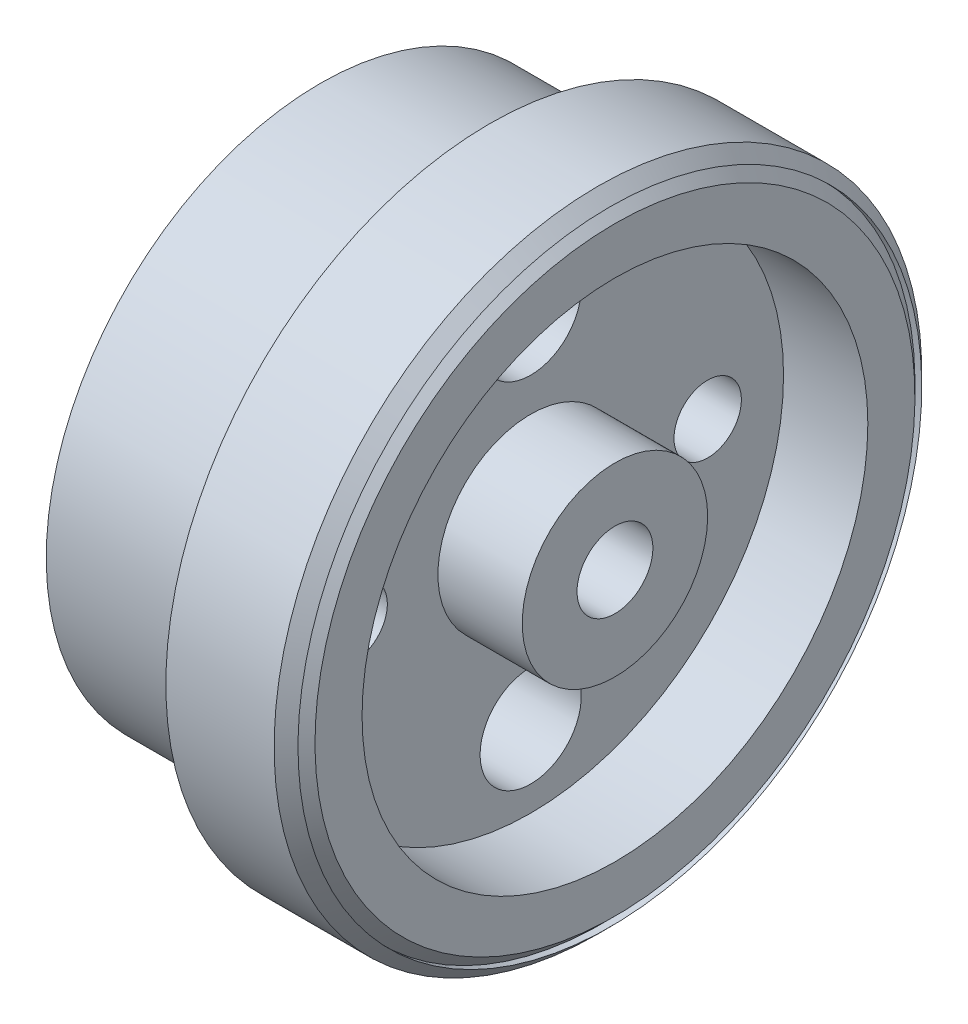
ISO-10303-21;
HEADER;
FILE_DESCRIPTION(('STEP AP214'),'2;1');
FILE_NAME('part.step','',(''),(''),'','','');
FILE_SCHEMA(('AUTOMOTIVE_DESIGN { 1 0 10303 214 1 1 1 1 }'));
ENDSEC;
DATA;
#1=APPLICATION_CONTEXT('core data for automotive mechanical design processes');
#2=APPLICATION_PROTOCOL_DEFINITION('international standard','automotive_design',2000,#1);
#3=PRODUCT_CONTEXT('',#1,'mechanical');
#4=PRODUCT('Part','Part','',(#3));
#5=PRODUCT_RELATED_PRODUCT_CATEGORY('part','',(#4));
#6=PRODUCT_DEFINITION_FORMATION('','',#4);
#7=PRODUCT_DEFINITION_CONTEXT('part definition',#1,'design');
#8=PRODUCT_DEFINITION('design','',#6,#7);
#9=PRODUCT_DEFINITION_SHAPE('','',#8);
#10=(LENGTH_UNIT() NAMED_UNIT(*) SI_UNIT(.MILLI.,.METRE.));
#11=(NAMED_UNIT(*) PLANE_ANGLE_UNIT() SI_UNIT($,.RADIAN.));
#12=(NAMED_UNIT(*) SI_UNIT($,.STERADIAN.) SOLID_ANGLE_UNIT());
#13=UNCERTAINTY_MEASURE_WITH_UNIT(LENGTH_MEASURE(1.E-05),#10,'distance_accuracy_value','');
#14=(GEOMETRIC_REPRESENTATION_CONTEXT(3) GLOBAL_UNCERTAINTY_ASSIGNED_CONTEXT((#13)) GLOBAL_UNIT_ASSIGNED_CONTEXT((#10,
#11,#12)) REPRESENTATION_CONTEXT('',''));
#15=CARTESIAN_POINT('',(0.,0.,0.));
#16=DIRECTION('',(0.,0.,1.));
#17=DIRECTION('',(1.,0.,0.));
#18=AXIS2_PLACEMENT_3D('',#15,#16,#17);
#19=CARTESIAN_POINT('',(0.,-4.5,0.));
#20=DIRECTION('',(-1.,0.,0.));
#21=DIRECTION('',(0.,-1.,0.));
#22=AXIS2_PLACEMENT_3D('',#19,#20,#21);
#23=PLANE('',#22);
#24=CARTESIAN_POINT('',(0.,0.,0.));
#25=DIRECTION('',(1.,0.,0.));
#26=DIRECTION('',(0.,1.,0.));
#27=AXIS2_PLACEMENT_3D('',#24,#25,#26);
#28=CIRCLE('',#27,4.5);
#29=CARTESIAN_POINT('',(0.,4.5,0.));
#30=VERTEX_POINT('',#29);
#31=EDGE_CURVE('E38',#30,#30,#28,.T.);
#32=ORIENTED_EDGE('',*,*,#31,.F.);
#33=EDGE_LOOP('',(#32));
#34=FACE_BOUND('',#33,.T.);
#35=CARTESIAN_POINT('',(0.,0.,0.));
#36=DIRECTION('',(1.,0.,0.));
#37=DIRECTION('',(0.,0.,-1.));
#38=AXIS2_PLACEMENT_3D('',#35,#36,#37);
#39=CIRCLE('',#38,11.0000000000005);
#40=CARTESIAN_POINT('',(0.,0.,-11.0000000000005));
#41=VERTEX_POINT('',#40);
#42=EDGE_CURVE('E97',#41,#41,#39,.T.);
#43=ORIENTED_EDGE('',*,*,#42,.T.);
#44=EDGE_LOOP('',(#43));
#45=FACE_BOUND('',#44,.T.);
#46=ADVANCED_FACE('F31',(#34,#45),#23,.F.);
#47=CARTESIAN_POINT('',(-1.41421356237327,0.,0.));
#48=DIRECTION('',(-1.,0.,0.));
#49=DIRECTION('',(0.,-1.,0.));
#50=AXIS2_PLACEMENT_3D('',#47,#48,#49);
#51=CONICAL_SURFACE('',#50,37.,0.785398163397326);
#52=CARTESIAN_POINT('',(0.,0.,0.));
#53=DIRECTION('',(1.,0.,0.));
#54=DIRECTION('',(0.,1.,0.));
#55=AXIS2_PLACEMENT_3D('',#52,#53,#54);
#56=CIRCLE('',#55,35.5857864376271);
#57=CARTESIAN_POINT('',(0.,35.5857864376271,0.));
#58=VERTEX_POINT('',#57);
#59=EDGE_CURVE('E10',#58,#58,#56,.T.);
#60=ORIENTED_EDGE('',*,*,#59,.F.);
#61=EDGE_LOOP('',(#60));
#62=FACE_BOUND('',#61,.T.);
#63=CARTESIAN_POINT('',(-1.41421356237327,0.,0.));
#64=DIRECTION('',(1.,0.,0.));
#65=DIRECTION('',(0.,1.,0.));
#66=AXIS2_PLACEMENT_3D('',#63,#64,#65);
#67=CIRCLE('',#66,37.);
#68=CARTESIAN_POINT('',(-1.41421356237328,37.,0.));
#69=VERTEX_POINT('',#68);
#70=EDGE_CURVE('E87',#69,#69,#67,.T.);
#71=ORIENTED_EDGE('',*,*,#70,.T.);
#72=EDGE_LOOP('',(#71));
#73=FACE_BOUND('',#72,.T.);
#74=ADVANCED_FACE('F33',(#62,#73),#51,.T.);
#75=CARTESIAN_POINT('',(0.,0.,0.));
#76=DIRECTION('',(1.,0.,0.));
#77=DIRECTION('',(0.,0.,-1.));
#78=AXIS2_PLACEMENT_3D('',#75,#76,#77);
#79=CIRCLE('',#78,30.);
#80=CARTESIAN_POINT('',(0.,0.,-30.));
#81=VERTEX_POINT('',#80);
#82=EDGE_CURVE('E91',#81,#81,#79,.T.);
#83=ORIENTED_EDGE('',*,*,#82,.F.);
#84=EDGE_LOOP('',(#83));
#85=FACE_BOUND('',#84,.T.);
#86=ORIENTED_EDGE('',*,*,#59,.T.);
#87=EDGE_LOOP('',(#86));
#88=FACE_BOUND('',#87,.T.);
#89=ADVANCED_FACE('F152',(#85,#88),#23,.F.);
#90=CARTESIAN_POINT('',(0.,0.,0.));
#91=DIRECTION('',(1.,0.,0.));
#92=DIRECTION('',(0.,1.,0.));
#93=AXIS2_PLACEMENT_3D('',#90,#91,#92);
#94=CYLINDRICAL_SURFACE('',#93,4.5);
#95=CARTESIAN_POINT('',(-20.4141633410307,0.,0.));
#96=DIRECTION('',(1.,0.,0.));
#97=DIRECTION('',(0.,1.,0.));
#98=AXIS2_PLACEMENT_3D('',#95,#96,#97);
#99=CIRCLE('',#98,4.5);
#100=CARTESIAN_POINT('',(-20.4141633410307,4.5,0.));
#101=VERTEX_POINT('',#100);
#102=EDGE_CURVE('E42',#101,#101,#99,.T.);
#103=ORIENTED_EDGE('',*,*,#102,.F.);
#104=EDGE_LOOP('',(#103));
#105=FACE_BOUND('',#104,.T.);
#106=ORIENTED_EDGE('',*,*,#31,.T.);
#107=EDGE_LOOP('',(#106));
#108=FACE_BOUND('',#107,.T.);
#109=ADVANCED_FACE('F154',(#105,#108),#94,.F.);
#110=CARTESIAN_POINT('',(-20.4141633410307,0.,0.));
#111=DIRECTION('',(-1.,0.,0.));
#112=DIRECTION('',(0.,-1.,0.));
#113=AXIS2_PLACEMENT_3D('',#110,#111,#112);
#114=CONICAL_SURFACE('',#113,4.5,0.785398163397443);
#115=CARTESIAN_POINT('',(-23.4290294676044,0.,0.));
#116=DIRECTION('',(1.,0.,0.));
#117=DIRECTION('',(0.,1.,0.));
#118=AXIS2_PLACEMENT_3D('',#115,#116,#117);
#119=CIRCLE('',#118,7.51486612657374);
#120=CARTESIAN_POINT('',(-23.4290294676044,7.51486612657374,0.));
#121=VERTEX_POINT('',#120);
#122=EDGE_CURVE('E46',#121,#121,#119,.T.);
#123=ORIENTED_EDGE('',*,*,#122,.F.);
#124=EDGE_LOOP('',(#123));
#125=FACE_BOUND('',#124,.T.);
#126=ORIENTED_EDGE('',*,*,#102,.T.);
#127=EDGE_LOOP('',(#126));
#128=FACE_BOUND('',#127,.T.);
#129=ADVANCED_FACE('F159',(#125,#128),#114,.F.);
#130=CARTESIAN_POINT('',(0.,0.,0.));
#131=DIRECTION('',(1.,0.,0.));
#132=DIRECTION('',(0.,1.,0.));
#133=AXIS2_PLACEMENT_3D('',#130,#131,#132);
#134=CYLINDRICAL_SURFACE('',#133,7.51486612657374);
#135=CARTESIAN_POINT('',(-43.4290294676045,0.,0.));
#136=DIRECTION('',(1.,0.,0.));
#137=DIRECTION('',(0.,1.,0.));
#138=AXIS2_PLACEMENT_3D('',#135,#136,#137);
#139=CIRCLE('',#138,7.51486612657374);
#140=CARTESIAN_POINT('',(-43.4290294676045,7.51486612657373,0.));
#141=VERTEX_POINT('',#140);
#142=EDGE_CURVE('E51',#141,#141,#139,.T.);
#143=ORIENTED_EDGE('',*,*,#142,.F.);
#144=EDGE_LOOP('',(#143));
#145=FACE_BOUND('',#144,.T.);
#146=ORIENTED_EDGE('',*,*,#122,.T.);
#147=EDGE_LOOP('',(#146));
#148=FACE_BOUND('',#147,.T.);
#149=ADVANCED_FACE('F228',(#145,#148),#134,.F.);
#150=CARTESIAN_POINT('',(-43.4290294676045,0.,0.));
#151=DIRECTION('',(-1.,0.,0.));
#152=DIRECTION('',(0.,-1.,0.));
#153=AXIS2_PLACEMENT_3D('',#150,#151,#152);
#154=CONICAL_SURFACE('',#153,7.51486612657374,0.700591132353698);
#155=CARTESIAN_POINT('',(-44.9579519391178,0.,0.));
#156=DIRECTION('',(1.,0.,0.));
#157=DIRECTION('',(0.,1.,0.));
#158=AXIS2_PLACEMENT_3D('',#155,#156,#157);
#159=CIRCLE('',#158,8.80420552180743);
#160=CARTESIAN_POINT('',(-44.9579519391178,8.80420552180742,0.));
#161=VERTEX_POINT('',#160);
#162=EDGE_CURVE('E54',#161,#161,#159,.T.);
#163=ORIENTED_EDGE('',*,*,#162,.F.);
#164=EDGE_LOOP('',(#163));
#165=FACE_BOUND('',#164,.T.);
#166=ORIENTED_EDGE('',*,*,#142,.T.);
#167=EDGE_LOOP('',(#166));
#168=FACE_BOUND('',#167,.T.);
#169=ADVANCED_FACE('F224',(#165,#168),#154,.F.);
#170=CARTESIAN_POINT('',(-44.9579519391178,-8.80420552180743,0.));
#171=DIRECTION('',(1.,0.,0.));
#172=DIRECTION('',(0.,1.,0.));
#173=AXIS2_PLACEMENT_3D('',#170,#171,#172);
#174=PLANE('',#173);
#175=CARTESIAN_POINT('',(-44.9579519391177,0.,0.));
#176=DIRECTION('',(1.,0.,0.));
#177=DIRECTION('',(0.,1.,0.));
#178=AXIS2_PLACEMENT_3D('',#175,#176,#177);
#179=CIRCLE('',#178,11.);
#180=CARTESIAN_POINT('',(-44.9579519391177,11.,0.));
#181=VERTEX_POINT('',#180);
#182=EDGE_CURVE('E57',#181,#181,#179,.T.);
#183=ORIENTED_EDGE('',*,*,#182,.F.);
#184=EDGE_LOOP('',(#183));
#185=FACE_BOUND('',#184,.T.);
#186=ORIENTED_EDGE('',*,*,#162,.T.);
#187=EDGE_LOOP('',(#186));
#188=FACE_BOUND('',#187,.T.);
#189=ADVANCED_FACE('F220',(#185,#188),#174,.F.);
#190=CARTESIAN_POINT('',(0.,0.,0.));
#191=DIRECTION('',(1.,0.,0.));
#192=DIRECTION('',(0.,1.,0.));
#193=AXIS2_PLACEMENT_3D('',#190,#191,#192);
#194=CYLINDRICAL_SURFACE('',#193,11.);
#195=CARTESIAN_POINT('',(-36.9579519391177,0.,0.));
#196=DIRECTION('',(1.,0.,0.));
#197=DIRECTION('',(0.,1.,0.));
#198=AXIS2_PLACEMENT_3D('',#195,#196,#197);
#199=CIRCLE('',#198,11.);
#200=CARTESIAN_POINT('',(-36.9579519391177,11.,0.));
#201=VERTEX_POINT('',#200);
#202=EDGE_CURVE('E60',#201,#201,#199,.T.);
#203=ORIENTED_EDGE('',*,*,#202,.F.);
#204=EDGE_LOOP('',(#203));
#205=FACE_BOUND('',#204,.T.);
#206=ORIENTED_EDGE('',*,*,#182,.T.);
#207=EDGE_LOOP('',(#206));
#208=FACE_BOUND('',#207,.T.);
#209=ADVANCED_FACE('F216',(#205,#208),#194,.T.);
#210=CARTESIAN_POINT('',(-36.9579519391177,-11.0143437946253,0.));
#211=DIRECTION('',(1.,0.,0.));
#212=DIRECTION('',(0.,1.,0.));
#213=AXIS2_PLACEMENT_3D('',#210,#211,#212);
#214=PLANE('',#213);
#215=CARTESIAN_POINT('',(-36.9579519391177,0.,0.));
#216=DIRECTION('',(1.,0.,0.));
#217=DIRECTION('',(0.,1.,0.));
#218=AXIS2_PLACEMENT_3D('',#215,#216,#217);
#219=CIRCLE('',#218,11.0143437946253);
#220=CARTESIAN_POINT('',(-36.9579519391177,11.0143437946253,0.));
#221=VERTEX_POINT('',#220);
#222=EDGE_CURVE('E63',#221,#221,#219,.T.);
#223=ORIENTED_EDGE('',*,*,#222,.F.);
#224=EDGE_LOOP('',(#223));
#225=FACE_BOUND('',#224,.T.);
#226=ORIENTED_EDGE('',*,*,#202,.T.);
#227=EDGE_LOOP('',(#226));
#228=FACE_BOUND('',#227,.T.);
#229=ADVANCED_FACE('F212',(#225,#228),#214,.F.);
#230=CARTESIAN_POINT('',(0.,0.,0.));
#231=DIRECTION('',(1.,0.,0.));
#232=DIRECTION('',(0.,1.,0.));
#233=AXIS2_PLACEMENT_3D('',#230,#231,#232);
#234=CYLINDRICAL_SURFACE('',#233,11.0143437946253);
#235=CARTESIAN_POINT('',(-34.9579519391177,0.,0.));
#236=DIRECTION('',(1.,0.,0.));
#237=DIRECTION('',(0.,1.,0.));
#238=AXIS2_PLACEMENT_3D('',#235,#236,#237);
#239=CIRCLE('',#238,11.0143437946253);
#240=CARTESIAN_POINT('',(-34.9579519391177,11.0143437946253,0.));
#241=VERTEX_POINT('',#240);
#242=EDGE_CURVE('E66',#241,#241,#239,.T.);
#243=ORIENTED_EDGE('',*,*,#242,.F.);
#244=EDGE_LOOP('',(#243));
#245=FACE_BOUND('',#244,.T.);
#246=ORIENTED_EDGE('',*,*,#222,.T.);
#247=EDGE_LOOP('',(#246));
#248=FACE_BOUND('',#247,.T.);
#249=ADVANCED_FACE('F208',(#245,#248),#234,.T.);
#250=CARTESIAN_POINT('',(-34.9579519391177,-32.5075953347839,0.));
#251=DIRECTION('',(1.,0.,0.));
#252=DIRECTION('',(0.,1.,0.));
#253=AXIS2_PLACEMENT_3D('',#250,#251,#252);
#254=PLANE('',#253);
#255=CARTESIAN_POINT('',(-34.9579519391177,-21.,0.));
#256=DIRECTION('',(1.,0.,0.));
#257=DIRECTION('',(0.,-1.,0.));
#258=AXIS2_PLACEMENT_3D('',#255,#256,#257);
#259=CIRCLE('',#258,6.00000000000048);
#260=CARTESIAN_POINT('',(-34.9579519391177,-27.0000000000005,0.));
#261=VERTEX_POINT('',#260);
#262=EDGE_CURVE('E120',#261,#261,#259,.T.);
#263=ORIENTED_EDGE('',*,*,#262,.T.);
#264=EDGE_LOOP('',(#263));
#265=FACE_BOUND('',#264,.T.);
#266=CARTESIAN_POINT('',(-34.9579519391178,21.,0.));
#267=DIRECTION('',(1.,0.,0.));
#268=DIRECTION('',(0.,1.,0.));
#269=AXIS2_PLACEMENT_3D('',#266,#267,#268);
#270=CIRCLE('',#269,6.00000000000048);
#271=CARTESIAN_POINT('',(-34.9579519391178,27.0000000000005,0.));
#272=VERTEX_POINT('',#271);
#273=EDGE_CURVE('E112',#272,#272,#270,.T.);
#274=ORIENTED_EDGE('',*,*,#273,.T.);
#275=EDGE_LOOP('',(#274));
#276=FACE_BOUND('',#275,.T.);
#277=CARTESIAN_POINT('',(-34.9579519391178,0.,-21.));
#278=DIRECTION('',(1.,0.,0.));
#279=DIRECTION('',(0.,1.,0.));
#280=AXIS2_PLACEMENT_3D('',#277,#278,#279);
#281=CIRCLE('',#280,4.);
#282=CARTESIAN_POINT('',(-34.9579519391178,4.,-21.));
#283=VERTEX_POINT('',#282);
#284=EDGE_CURVE('E100',#283,#283,#281,.T.);
#285=ORIENTED_EDGE('',*,*,#284,.T.);
#286=EDGE_LOOP('',(#285));
#287=FACE_BOUND('',#286,.T.);
#288=CARTESIAN_POINT('',(-34.9579519391178,0.,21.));
#289=DIRECTION('',(1.,0.,0.));
#290=DIRECTION('',(0.,1.,0.));
#291=AXIS2_PLACEMENT_3D('',#288,#289,#290);
#292=CIRCLE('',#291,4.);
#293=CARTESIAN_POINT('',(-34.9579519391178,4.,21.));
#294=VERTEX_POINT('',#293);
#295=EDGE_CURVE('E105',#294,#294,#292,.T.);
#296=ORIENTED_EDGE('',*,*,#295,.T.);
#297=EDGE_LOOP('',(#296));
#298=FACE_BOUND('',#297,.T.);
#299=CARTESIAN_POINT('',(-34.9579519391178,0.,0.));
#300=DIRECTION('',(1.,0.,0.));
#301=DIRECTION('',(0.,1.,0.));
#302=AXIS2_PLACEMENT_3D('',#299,#300,#301);
#303=CIRCLE('',#302,32.5075953347839);
#304=CARTESIAN_POINT('',(-34.9579519391178,32.5075953347839,0.));
#305=VERTEX_POINT('',#304);
#306=EDGE_CURVE('E69',#305,#305,#303,.T.);
#307=ORIENTED_EDGE('',*,*,#306,.F.);
#308=EDGE_LOOP('',(#307));
#309=FACE_BOUND('',#308,.T.);
#310=ORIENTED_EDGE('',*,*,#242,.T.);
#311=EDGE_LOOP('',(#310));
#312=FACE_BOUND('',#311,.T.);
#313=ADVANCED_FACE('F204',(#265,#276,#287,#298,#309,#312),#254,.F.);
#314=CARTESIAN_POINT('',(0.,0.,0.));
#315=DIRECTION('',(1.,0.,0.));
#316=DIRECTION('',(0.,1.,0.));
#317=AXIS2_PLACEMENT_3D('',#314,#315,#316);
#318=CYLINDRICAL_SURFACE('',#317,32.5075953347839);
#319=CARTESIAN_POINT('',(-15.9579519391178,0.,0.));
#320=DIRECTION('',(1.,0.,0.));
#321=DIRECTION('',(0.,1.,0.));
#322=AXIS2_PLACEMENT_3D('',#319,#320,#321);
#323=CIRCLE('',#322,32.5075953347839);
#324=CARTESIAN_POINT('',(-15.9579519391178,32.5075953347839,0.));
#325=VERTEX_POINT('',#324);
#326=EDGE_CURVE('E72',#325,#325,#323,.T.);
#327=ORIENTED_EDGE('',*,*,#326,.F.);
#328=EDGE_LOOP('',(#327));
#329=FACE_BOUND('',#328,.T.);
#330=ORIENTED_EDGE('',*,*,#306,.T.);
#331=EDGE_LOOP('',(#330));
#332=FACE_BOUND('',#331,.T.);
#333=ADVANCED_FACE('F200',(#329,#332),#318,.T.);
#334=CARTESIAN_POINT('',(-15.9579519391178,-36.7408732662715,0.));
#335=DIRECTION('',(1.,0.,0.));
#336=DIRECTION('',(0.,1.,0.));
#337=AXIS2_PLACEMENT_3D('',#334,#335,#336);
#338=PLANE('',#337);
#339=CARTESIAN_POINT('',(-15.9579519391178,0.,0.));
#340=DIRECTION('',(1.,0.,0.));
#341=DIRECTION('',(0.,1.,0.));
#342=AXIS2_PLACEMENT_3D('',#339,#340,#341);
#343=CIRCLE('',#342,36.7408732662715);
#344=CARTESIAN_POINT('',(-15.9579519391178,36.7408732662715,0.));
#345=VERTEX_POINT('',#344);
#346=EDGE_CURVE('E75',#345,#345,#343,.T.);
#347=ORIENTED_EDGE('',*,*,#346,.F.);
#348=EDGE_LOOP('',(#347));
#349=FACE_BOUND('',#348,.T.);
#350=ORIENTED_EDGE('',*,*,#326,.T.);
#351=EDGE_LOOP('',(#350));
#352=FACE_BOUND('',#351,.T.);
#353=ADVANCED_FACE('F196',(#349,#352),#338,.F.);
#354=CARTESIAN_POINT('',(-15.9579519391178,0.,0.));
#355=DIRECTION('',(1.,0.,0.));
#356=DIRECTION('',(0.,1.,0.));
#357=AXIS2_PLACEMENT_3D('',#354,#355,#356);
#358=CONICAL_SURFACE('',#357,36.7408732662715,0.991175065968626);
#359=CARTESIAN_POINT('',(-14.8625377464751,0.,0.));
#360=DIRECTION('',(1.,0.,0.));
#361=DIRECTION('',(0.,1.,0.));
#362=AXIS2_PLACEMENT_3D('',#359,#360,#361);
#363=CIRCLE('',#362,38.4142135623729);
#364=CARTESIAN_POINT('',(-14.8625377464751,38.4142135623729,0.));
#365=VERTEX_POINT('',#364);
#366=EDGE_CURVE('E78',#365,#365,#363,.T.);
#367=ORIENTED_EDGE('',*,*,#366,.F.);
#368=EDGE_LOOP('',(#367));
#369=FACE_BOUND('',#368,.T.);
#370=ORIENTED_EDGE('',*,*,#346,.T.);
#371=EDGE_LOOP('',(#370));
#372=FACE_BOUND('',#371,.T.);
#373=ADVANCED_FACE('F192',(#369,#372),#358,.T.);
#374=CARTESIAN_POINT('',(0.,0.,0.));
#375=DIRECTION('',(1.,0.,0.));
#376=DIRECTION('',(0.,1.,0.));
#377=AXIS2_PLACEMENT_3D('',#374,#375,#376);
#378=CYLINDRICAL_SURFACE('',#377,38.4142135623729);
#379=CARTESIAN_POINT('',(-2.01730516780989,0.,0.));
#380=DIRECTION('',(1.,0.,0.));
#381=DIRECTION('',(0.,1.,0.));
#382=AXIS2_PLACEMENT_3D('',#379,#380,#381);
#383=CIRCLE('',#382,38.4142135623729);
#384=CARTESIAN_POINT('',(-2.0173051678099,38.4142135623729,0.));
#385=VERTEX_POINT('',#384);
#386=EDGE_CURVE('E81',#385,#385,#383,.T.);
#387=ORIENTED_EDGE('',*,*,#386,.F.);
#388=EDGE_LOOP('',(#387));
#389=FACE_BOUND('',#388,.T.);
#390=ORIENTED_EDGE('',*,*,#366,.T.);
#391=EDGE_LOOP('',(#390));
#392=FACE_BOUND('',#391,.T.);
#393=ADVANCED_FACE('F188',(#389,#392),#378,.T.);
#394=CARTESIAN_POINT('',(-2.01730516780989,0.,0.));
#395=DIRECTION('',(-1.,0.,0.));
#396=DIRECTION('',(0.,-1.,0.));
#397=AXIS2_PLACEMENT_3D('',#394,#395,#396);
#398=CONICAL_SURFACE('',#397,38.4142135623729,0.785398163397324);
#399=CARTESIAN_POINT('',(-0.603091605436611,0.,0.));
#400=DIRECTION('',(1.,0.,0.));
#401=DIRECTION('',(0.,1.,0.));
#402=AXIS2_PLACEMENT_3D('',#399,#400,#401);
#403=CIRCLE('',#402,37.);
#404=CARTESIAN_POINT('',(-0.603091605436616,37.,0.));
#405=VERTEX_POINT('',#404);
#406=EDGE_CURVE('E84',#405,#405,#403,.T.);
#407=ORIENTED_EDGE('',*,*,#406,.F.);
#408=EDGE_LOOP('',(#407));
#409=FACE_BOUND('',#408,.T.);
#410=ORIENTED_EDGE('',*,*,#386,.T.);
#411=EDGE_LOOP('',(#410));
#412=FACE_BOUND('',#411,.T.);
#413=ADVANCED_FACE('F184',(#409,#412),#398,.T.);
#414=CARTESIAN_POINT('',(0.,0.,0.));
#415=DIRECTION('',(1.,0.,0.));
#416=DIRECTION('',(0.,1.,0.));
#417=AXIS2_PLACEMENT_3D('',#414,#415,#416);
#418=CYLINDRICAL_SURFACE('',#417,37.);
#419=ORIENTED_EDGE('',*,*,#70,.F.);
#420=EDGE_LOOP('',(#419));
#421=FACE_BOUND('',#420,.T.);
#422=ORIENTED_EDGE('',*,*,#406,.T.);
#423=EDGE_LOOP('',(#422));
#424=FACE_BOUND('',#423,.T.);
#425=ADVANCED_FACE('F148',(#421,#424),#418,.F.);
#426=CARTESIAN_POINT('',(-10.,0.,0.));
#427=DIRECTION('',(1.,0.,0.));
#428=DIRECTION('',(0.,0.,-1.));
#429=AXIS2_PLACEMENT_3D('',#426,#427,#428);
#430=CYLINDRICAL_SURFACE('',#429,30.);
#431=CARTESIAN_POINT('',(-10.,0.,0.));
#432=DIRECTION('',(1.,0.,0.));
#433=DIRECTION('',(0.,0.,-1.));
#434=AXIS2_PLACEMENT_3D('',#431,#432,#433);
#435=CIRCLE('',#434,30.);
#436=CARTESIAN_POINT('',(-10.,0.,-30.));
#437=VERTEX_POINT('',#436);
#438=EDGE_CURVE('E90',#437,#437,#435,.T.);
#439=ORIENTED_EDGE('',*,*,#438,.F.);
#440=EDGE_LOOP('',(#439));
#441=FACE_BOUND('',#440,.T.);
#442=ORIENTED_EDGE('',*,*,#82,.T.);
#443=EDGE_LOOP('',(#442));
#444=FACE_BOUND('',#443,.T.);
#445=ADVANCED_FACE('F134',(#441,#444),#430,.F.);
#446=CARTESIAN_POINT('',(-10.,0.,0.));
#447=DIRECTION('',(1.,0.,0.));
#448=DIRECTION('',(0.,0.,-1.));
#449=AXIS2_PLACEMENT_3D('',#446,#447,#448);
#450=PLANE('',#449);
#451=CARTESIAN_POINT('',(-9.99999999999999,-21.,0.));
#452=DIRECTION('',(1.,0.,0.));
#453=DIRECTION('',(0.,0.,1.));
#454=AXIS2_PLACEMENT_3D('',#451,#452,#453);
#455=CIRCLE('',#454,6.00000000000048);
#456=CARTESIAN_POINT('',(-9.99999999999999,-21.,6.00000000000048));
#457=VERTEX_POINT('',#456);
#458=EDGE_CURVE('E123',#457,#457,#455,.T.);
#459=ORIENTED_EDGE('',*,*,#458,.F.);
#460=EDGE_LOOP('',(#459));
#461=FACE_BOUND('',#460,.T.);
#462=CARTESIAN_POINT('',(-10.,21.,0.));
#463=DIRECTION('',(1.,0.,0.));
#464=DIRECTION('',(0.,0.,-1.));
#465=AXIS2_PLACEMENT_3D('',#462,#463,#464);
#466=CIRCLE('',#465,6.00000000000048);
#467=CARTESIAN_POINT('',(-10.,21.,-6.00000000000048));
#468=VERTEX_POINT('',#467);
#469=EDGE_CURVE('E117',#468,#468,#466,.T.);
#470=ORIENTED_EDGE('',*,*,#469,.F.);
#471=EDGE_LOOP('',(#470));
#472=FACE_BOUND('',#471,.T.);
#473=CARTESIAN_POINT('',(-10.,0.,-21.));
#474=DIRECTION('',(1.,0.,0.));
#475=DIRECTION('',(0.,0.,-1.));
#476=AXIS2_PLACEMENT_3D('',#473,#474,#475);
#477=CIRCLE('',#476,4.);
#478=CARTESIAN_POINT('',(-10.,0.,-25.));
#479=VERTEX_POINT('',#478);
#480=EDGE_CURVE('E108',#479,#479,#477,.T.);
#481=ORIENTED_EDGE('',*,*,#480,.F.);
#482=EDGE_LOOP('',(#481));
#483=FACE_BOUND('',#482,.T.);
#484=CARTESIAN_POINT('',(-10.,0.,21.));
#485=DIRECTION('',(1.,0.,0.));
#486=DIRECTION('',(0.,0.,1.));
#487=AXIS2_PLACEMENT_3D('',#484,#485,#486);
#488=CIRCLE('',#487,4.);
#489=CARTESIAN_POINT('',(-10.,0.,25.));
#490=VERTEX_POINT('',#489);
#491=EDGE_CURVE('E109',#490,#490,#488,.T.);
#492=ORIENTED_EDGE('',*,*,#491,.F.);
#493=EDGE_LOOP('',(#492));
#494=FACE_BOUND('',#493,.T.);
#495=CARTESIAN_POINT('',(-10.,0.,0.));
#496=DIRECTION('',(1.,0.,0.));
#497=DIRECTION('',(0.,0.,-1.));
#498=AXIS2_PLACEMENT_3D('',#495,#496,#497);
#499=CIRCLE('',#498,11.0000000000005);
#500=CARTESIAN_POINT('',(-10.,0.,-11.0000000000005));
#501=VERTEX_POINT('',#500);
#502=EDGE_CURVE('E94',#501,#501,#499,.T.);
#503=ORIENTED_EDGE('',*,*,#502,.F.);
#504=EDGE_LOOP('',(#503));
#505=FACE_BOUND('',#504,.T.);
#506=ORIENTED_EDGE('',*,*,#438,.T.);
#507=EDGE_LOOP('',(#506));
#508=FACE_BOUND('',#507,.T.);
#509=ADVANCED_FACE('F130',(#461,#472,#483,#494,#505,#508),#450,.T.);
#510=CARTESIAN_POINT('',(-10.,0.,0.));
#511=DIRECTION('',(1.,0.,0.));
#512=DIRECTION('',(0.,0.,-1.));
#513=AXIS2_PLACEMENT_3D('',#510,#511,#512);
#514=CYLINDRICAL_SURFACE('',#513,11.0000000000005);
#515=ORIENTED_EDGE('',*,*,#502,.T.);
#516=EDGE_LOOP('',(#515));
#517=FACE_BOUND('',#516,.T.);
#518=ORIENTED_EDGE('',*,*,#42,.F.);
#519=EDGE_LOOP('',(#518));
#520=FACE_BOUND('',#519,.T.);
#521=ADVANCED_FACE('F133',(#517,#520),#514,.T.);
#522=CARTESIAN_POINT('',(-44.9579519391178,0.,21.));
#523=DIRECTION('',(1.,0.,0.));
#524=DIRECTION('',(0.,0.,-1.));
#525=AXIS2_PLACEMENT_3D('',#522,#523,#524);
#526=CYLINDRICAL_SURFACE('',#525,4.);
#527=ORIENTED_EDGE('',*,*,#491,.T.);
#528=EDGE_LOOP('',(#527));
#529=FACE_BOUND('',#528,.T.);
#530=ORIENTED_EDGE('',*,*,#295,.F.);
#531=EDGE_LOOP('',(#530));
#532=FACE_BOUND('',#531,.T.);
#533=ADVANCED_FACE('F171',(#529,#532),#526,.F.);
#534=CARTESIAN_POINT('',(-44.9579519391178,0.,-21.));
#535=DIRECTION('',(1.,0.,0.));
#536=DIRECTION('',(0.,0.,-1.));
#537=AXIS2_PLACEMENT_3D('',#534,#535,#536);
#538=CYLINDRICAL_SURFACE('',#537,4.);
#539=ORIENTED_EDGE('',*,*,#480,.T.);
#540=EDGE_LOOP('',(#539));
#541=FACE_BOUND('',#540,.T.);
#542=ORIENTED_EDGE('',*,*,#284,.F.);
#543=EDGE_LOOP('',(#542));
#544=FACE_BOUND('',#543,.T.);
#545=ADVANCED_FACE('F177',(#541,#544),#538,.F.);
#546=CARTESIAN_POINT('',(-44.9579519391178,21.,0.));
#547=DIRECTION('',(1.,0.,0.));
#548=DIRECTION('',(0.,0.,-1.));
#549=AXIS2_PLACEMENT_3D('',#546,#547,#548);
#550=CYLINDRICAL_SURFACE('',#549,6.00000000000048);
#551=ORIENTED_EDGE('',*,*,#469,.T.);
#552=EDGE_LOOP('',(#551));
#553=FACE_BOUND('',#552,.T.);
#554=ORIENTED_EDGE('',*,*,#273,.F.);
#555=EDGE_LOOP('',(#554));
#556=FACE_BOUND('',#555,.T.);
#557=ADVANCED_FACE('F313',(#553,#556),#550,.F.);
#558=CARTESIAN_POINT('',(-44.9579519391178,-21.,0.));
#559=DIRECTION('',(1.,0.,0.));
#560=DIRECTION('',(0.,0.,1.));
#561=AXIS2_PLACEMENT_3D('',#558,#559,#560);
#562=CYLINDRICAL_SURFACE('',#561,6.00000000000048);
#563=ORIENTED_EDGE('',*,*,#458,.T.);
#564=EDGE_LOOP('',(#563));
#565=FACE_BOUND('',#564,.T.);
#566=ORIENTED_EDGE('',*,*,#262,.F.);
#567=EDGE_LOOP('',(#566));
#568=FACE_BOUND('',#567,.T.);
#569=ADVANCED_FACE('F127',(#565,#568),#562,.F.);
#570=CLOSED_SHELL('',(#46,#74,#89,#109,#129,#149,#169,#189,#209,#229,#249,#313,#333,#353,#373,
#393,#413,#425,#445,#509,#521,#533,#545,#557,#569));
#571=MANIFOLD_SOLID_BREP('B2',#570);
#572=ADVANCED_BREP_SHAPE_REPRESENTATION('',(#18,#571),#14);
#573=SHAPE_DEFINITION_REPRESENTATION(#9,#572);
ENDSEC;
END-ISO-10303-21;
